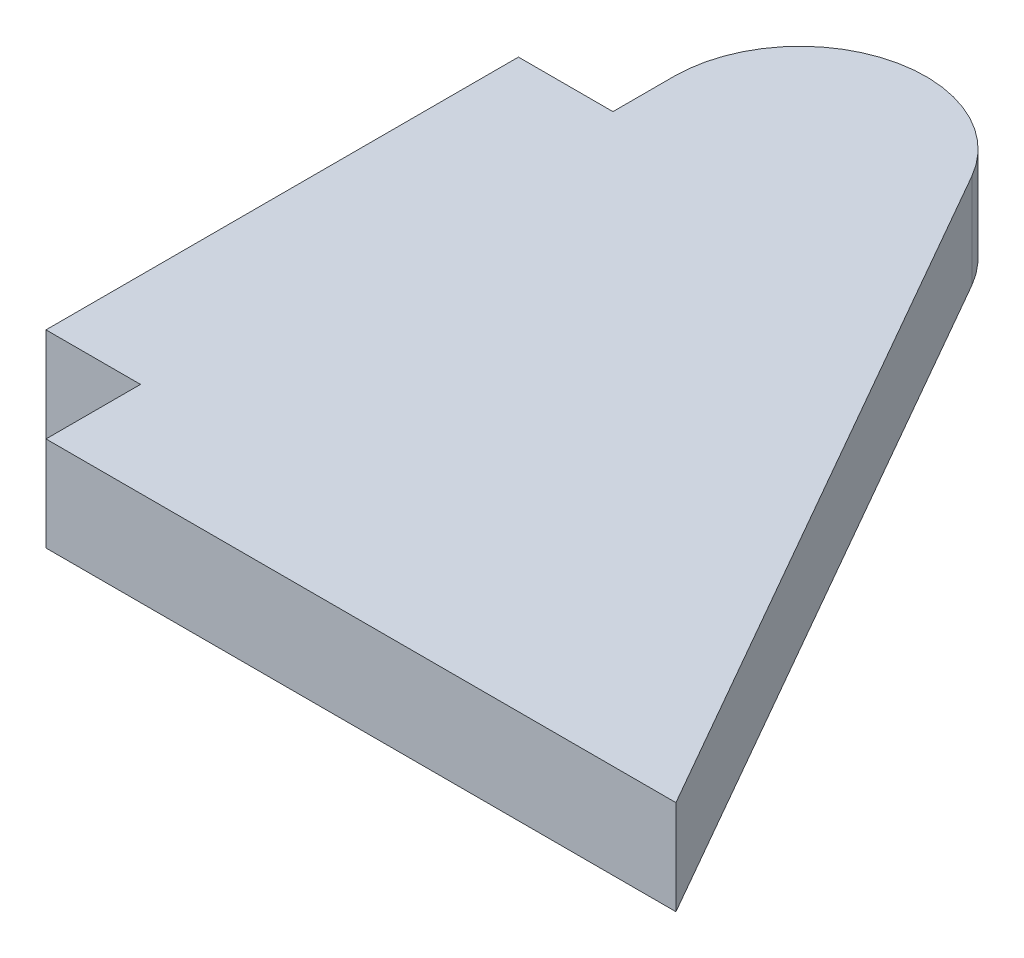
ISO-10303-21;
HEADER;
FILE_DESCRIPTION(('STEP AP214'),'2;1');
FILE_NAME('part.step','',(''),(''),'','','');
FILE_SCHEMA(('AUTOMOTIVE_DESIGN { 1 0 10303 214 1 1 1 1 }'));
ENDSEC;
DATA;
#1=APPLICATION_CONTEXT('core data for automotive mechanical design processes');
#2=APPLICATION_PROTOCOL_DEFINITION('international standard','automotive_design',2000,#1);
#3=PRODUCT_CONTEXT('',#1,'mechanical');
#4=PRODUCT('Part','Part','',(#3));
#5=PRODUCT_RELATED_PRODUCT_CATEGORY('part','',(#4));
#6=PRODUCT_DEFINITION_FORMATION('','',#4);
#7=PRODUCT_DEFINITION_CONTEXT('part definition',#1,'design');
#8=PRODUCT_DEFINITION('design','',#6,#7);
#9=PRODUCT_DEFINITION_SHAPE('','',#8);
#10=(LENGTH_UNIT() NAMED_UNIT(*) SI_UNIT(.MILLI.,.METRE.));
#11=(NAMED_UNIT(*) PLANE_ANGLE_UNIT() SI_UNIT($,.RADIAN.));
#12=(NAMED_UNIT(*) SI_UNIT($,.STERADIAN.) SOLID_ANGLE_UNIT());
#13=UNCERTAINTY_MEASURE_WITH_UNIT(LENGTH_MEASURE(1.E-05),#10,'distance_accuracy_value','');
#14=(GEOMETRIC_REPRESENTATION_CONTEXT(3) GLOBAL_UNCERTAINTY_ASSIGNED_CONTEXT((#13)) GLOBAL_UNIT_ASSIGNED_CONTEXT((#10,
#11,#12)) REPRESENTATION_CONTEXT('',''));
#15=CARTESIAN_POINT('',(0.,0.,0.));
#16=DIRECTION('',(0.,0.,1.));
#17=DIRECTION('',(1.,0.,0.));
#18=AXIS2_PLACEMENT_3D('',#15,#16,#17);
#19=CARTESIAN_POINT('',(-10.,1.5,-17.5));
#20=DIRECTION('',(1.,0.,0.));
#21=DIRECTION('',(0.,0.,-1.));
#22=AXIS2_PLACEMENT_3D('',#19,#20,#21);
#23=PLANE('',#22);
#24=DIRECTION('',(0.,0.,1.));
#25=VECTOR('',#24,1.);
#26=CARTESIAN_POINT('',(-10.,1.5,-17.5));
#27=LINE('',#26,#25);
#28=CARTESIAN_POINT('',(-10.,1.5,-2.43774225170145));
#29=VERTEX_POINT('',#28);
#30=CARTESIAN_POINT('',(-10.,1.5,-0.499999999999997));
#31=VERTEX_POINT('',#30);
#32=EDGE_CURVE('E99',#29,#31,#27,.T.);
#33=ORIENTED_EDGE('',*,*,#32,.F.);
#34=DIRECTION('',(0.,-1.,0.));
#35=VECTOR('',#34,1.);
#36=CARTESIAN_POINT('',(-10.,1.5,-2.43774225170145));
#37=LINE('',#36,#35);
#38=CARTESIAN_POINT('',(-10.,-1.5,-2.43774225170145));
#39=VERTEX_POINT('',#38);
#40=EDGE_CURVE('E144',#29,#39,#37,.T.);
#41=ORIENTED_EDGE('',*,*,#40,.T.);
#42=DIRECTION('',(0.,0.,1.));
#43=VECTOR('',#42,1.);
#44=CARTESIAN_POINT('',(-10.,-1.5,-17.5));
#45=LINE('',#44,#43);
#46=CARTESIAN_POINT('',(-10.,-1.5,-0.499999999999997));
#47=VERTEX_POINT('',#46);
#48=EDGE_CURVE('E122',#39,#47,#45,.T.);
#49=ORIENTED_EDGE('',*,*,#48,.T.);
#50=DIRECTION('',(0.,-1.,0.));
#51=VECTOR('',#50,1.);
#52=CARTESIAN_POINT('',(-10.,1.5,-0.499999999999997));
#53=LINE('',#52,#51);
#54=EDGE_CURVE('E115',#31,#47,#53,.T.);
#55=ORIENTED_EDGE('',*,*,#54,.F.);
#56=EDGE_LOOP('',(#33,#41,#49,#55));
#57=FACE_BOUND('',#56,.T.);
#58=ADVANCED_FACE('F35',(#57),#23,.F.);
#59=CARTESIAN_POINT('',(-10.,1.5,14.5));
#60=VERTEX_POINT('',#59);
#61=CARTESIAN_POINT('',(-10.,1.5,17.5));
#62=VERTEX_POINT('',#61);
#63=EDGE_CURVE('E110',#60,#62,#27,.T.);
#64=ORIENTED_EDGE('',*,*,#63,.F.);
#65=DIRECTION('',(0.,-1.,0.));
#66=VECTOR('',#65,1.);
#67=CARTESIAN_POINT('',(-10.,1.5,14.5));
#68=LINE('',#67,#66);
#69=CARTESIAN_POINT('',(-10.,-1.5,14.5));
#70=VERTEX_POINT('',#69);
#71=EDGE_CURVE('E159',#60,#70,#68,.T.);
#72=ORIENTED_EDGE('',*,*,#71,.T.);
#73=CARTESIAN_POINT('',(-10.,-1.5,17.5));
#74=VERTEX_POINT('',#73);
#75=EDGE_CURVE('E124',#70,#74,#45,.T.);
#76=ORIENTED_EDGE('',*,*,#75,.T.);
#77=DIRECTION('',(0.,-1.,0.));
#78=VECTOR('',#77,1.);
#79=CARTESIAN_POINT('',(-10.,1.5,17.5));
#80=LINE('',#79,#78);
#81=EDGE_CURVE('E141',#62,#74,#80,.T.);
#82=ORIENTED_EDGE('',*,*,#81,.F.);
#83=EDGE_LOOP('',(#64,#72,#76,#82));
#84=FACE_BOUND('',#83,.T.);
#85=ADVANCED_FACE('F173',(#84),#23,.F.);
#86=CARTESIAN_POINT('',(-10.,1.5,17.5));
#87=DIRECTION('',(0.,0.,-1.));
#88=DIRECTION('',(-1.,0.,0.));
#89=AXIS2_PLACEMENT_3D('',#86,#87,#88);
#90=PLANE('',#89);
#91=DIRECTION('',(1.,0.,0.));
#92=VECTOR('',#91,1.);
#93=CARTESIAN_POINT('',(-10.,-1.5,17.5));
#94=LINE('',#93,#92);
#95=CARTESIAN_POINT('',(10.,-1.5,17.5));
#96=VERTEX_POINT('',#95);
#97=EDGE_CURVE('E135',#74,#96,#94,.T.);
#98=ORIENTED_EDGE('',*,*,#97,.T.);
#99=DIRECTION('',(0.,-1.,0.));
#100=VECTOR('',#99,1.);
#101=CARTESIAN_POINT('',(10.,1.5,17.5));
#102=LINE('',#101,#100);
#103=CARTESIAN_POINT('',(10.,1.5,17.5));
#104=VERTEX_POINT('',#103);
#105=EDGE_CURVE('E133',#104,#96,#102,.T.);
#106=ORIENTED_EDGE('',*,*,#105,.F.);
#107=DIRECTION('',(1.,0.,0.));
#108=VECTOR('',#107,1.);
#109=CARTESIAN_POINT('',(-10.,1.5,17.5));
#110=LINE('',#109,#108);
#111=EDGE_CURVE('E109',#62,#104,#110,.T.);
#112=ORIENTED_EDGE('',*,*,#111,.F.);
#113=ORIENTED_EDGE('',*,*,#81,.T.);
#114=EDGE_LOOP('',(#98,#106,#112,#113));
#115=FACE_BOUND('',#114,.T.);
#116=ADVANCED_FACE('F177',(#115),#90,.F.);
#117=CARTESIAN_POINT('',(-10.,1.5,-17.5));
#118=DIRECTION('',(-0.868243142124459,0.,0.496138938356834));
#119=DIRECTION('',(0.496138938356834,0.,0.868243142124459));
#120=AXIS2_PLACEMENT_3D('',#117,#118,#119);
#121=PLANE('',#120);
#122=DIRECTION('',(-0.496138938356834,0.,-0.868243142124459));
#123=VECTOR('',#122,1.);
#124=CARTESIAN_POINT('',(-10.,-1.5,-17.5));
#125=LINE('',#124,#123);
#126=CARTESIAN_POINT('',(-2.52702743150216,-1.5,-4.42229800512879));
#127=VERTEX_POINT('',#126);
#128=EDGE_CURVE('E137',#96,#127,#125,.T.);
#129=ORIENTED_EDGE('',*,*,#128,.T.);
#130=DIRECTION('',(0.,-1.,0.));
#131=VECTOR('',#130,1.);
#132=CARTESIAN_POINT('',(-2.52702743150216,1.5,-4.42229800512879));
#133=LINE('',#132,#131);
#134=CARTESIAN_POINT('',(-2.52702743150216,1.5,-4.42229800512879));
#135=VERTEX_POINT('',#134);
#136=EDGE_CURVE('E43',#127,#135,#133,.F.);
#137=ORIENTED_EDGE('',*,*,#136,.T.);
#138=DIRECTION('',(-0.496138938356834,0.,-0.868243142124459));
#139=VECTOR('',#138,1.);
#140=CARTESIAN_POINT('',(-10.,1.5,-17.5));
#141=LINE('',#140,#139);
#142=EDGE_CURVE('E132',#104,#135,#141,.T.);
#143=ORIENTED_EDGE('',*,*,#142,.F.);
#144=ORIENTED_EDGE('',*,*,#105,.T.);
#145=EDGE_LOOP('',(#129,#137,#143,#144));
#146=FACE_BOUND('',#145,.T.);
#147=ADVANCED_FACE('F178',(#146),#121,.F.);
#148=CARTESIAN_POINT('',(0.,1.5,0.));
#149=DIRECTION('',(0.,1.,0.));
#150=DIRECTION('',(0.,0.,1.));
#151=AXIS2_PLACEMENT_3D('',#148,#149,#150);
#152=PLANE('',#151);
#153=ORIENTED_EDGE('',*,*,#142,.T.);
#154=CARTESIAN_POINT('',(-6.,1.5,-2.43774225170145));
#155=DIRECTION('',(0.,1.,0.));
#156=DIRECTION('',(0.,0.,1.));
#157=AXIS2_PLACEMENT_3D('',#154,#155,#156);
#158=CIRCLE('',#157,4.);
#159=EDGE_CURVE('E11',#135,#29,#158,.T.);
#160=ORIENTED_EDGE('',*,*,#159,.T.);
#161=ORIENTED_EDGE('',*,*,#32,.T.);
#162=DIRECTION('',(-1.,0.,0.));
#163=VECTOR('',#162,1.);
#164=CARTESIAN_POINT('',(-10.,1.5,-0.499999999999997));
#165=LINE('',#164,#163);
#166=CARTESIAN_POINT('',(-13.,1.5,-0.499999999999997));
#167=VERTEX_POINT('',#166);
#168=EDGE_CURVE('E102',#31,#167,#165,.T.);
#169=ORIENTED_EDGE('',*,*,#168,.T.);
#170=DIRECTION('',(0.,0.,1.));
#171=VECTOR('',#170,1.);
#172=CARTESIAN_POINT('',(-13.,1.5,-0.499999999999997));
#173=LINE('',#172,#171);
#174=CARTESIAN_POINT('',(-13.,1.5,14.5));
#175=VERTEX_POINT('',#174);
#176=EDGE_CURVE('E119',#167,#175,#173,.T.);
#177=ORIENTED_EDGE('',*,*,#176,.T.);
#178=DIRECTION('',(1.,0.,0.));
#179=VECTOR('',#178,1.);
#180=CARTESIAN_POINT('',(-10.,1.5,14.5));
#181=LINE('',#180,#179);
#182=EDGE_CURVE('E155',#175,#60,#181,.T.);
#183=ORIENTED_EDGE('',*,*,#182,.T.);
#184=ORIENTED_EDGE('',*,*,#63,.T.);
#185=ORIENTED_EDGE('',*,*,#111,.T.);
#186=EDGE_LOOP('',(#153,#160,#161,#169,#177,#183,#184,#185));
#187=FACE_BOUND('',#186,.T.);
#188=ADVANCED_FACE('F101',(#187),#152,.T.);
#189=CARTESIAN_POINT('',(0.,-1.5,0.));
#190=DIRECTION('',(0.,1.,0.));
#191=DIRECTION('',(0.,0.,1.));
#192=AXIS2_PLACEMENT_3D('',#189,#190,#191);
#193=PLANE('',#192);
#194=ORIENTED_EDGE('',*,*,#48,.F.);
#195=CARTESIAN_POINT('',(-6.,-1.5,-2.43774225170145));
#196=DIRECTION('',(0.,1.,0.));
#197=DIRECTION('',(0.,0.,1.));
#198=AXIS2_PLACEMENT_3D('',#195,#196,#197);
#199=CIRCLE('',#198,4.);
#200=EDGE_CURVE('E57',#39,#127,#199,.F.);
#201=ORIENTED_EDGE('',*,*,#200,.T.);
#202=ORIENTED_EDGE('',*,*,#128,.F.);
#203=ORIENTED_EDGE('',*,*,#97,.F.);
#204=ORIENTED_EDGE('',*,*,#75,.F.);
#205=DIRECTION('',(1.,0.,0.));
#206=VECTOR('',#205,1.);
#207=CARTESIAN_POINT('',(-10.,-1.5,14.5));
#208=LINE('',#207,#206);
#209=CARTESIAN_POINT('',(-13.,-1.5,14.5));
#210=VERTEX_POINT('',#209);
#211=EDGE_CURVE('E120',#210,#70,#208,.T.);
#212=ORIENTED_EDGE('',*,*,#211,.F.);
#213=DIRECTION('',(0.,0.,1.));
#214=VECTOR('',#213,1.);
#215=CARTESIAN_POINT('',(-13.,-1.5,-0.499999999999997));
#216=LINE('',#215,#214);
#217=CARTESIAN_POINT('',(-13.,-1.5,-0.499999999999997));
#218=VERTEX_POINT('',#217);
#219=EDGE_CURVE('E151',#218,#210,#216,.T.);
#220=ORIENTED_EDGE('',*,*,#219,.F.);
#221=DIRECTION('',(-1.,0.,0.));
#222=VECTOR('',#221,1.);
#223=CARTESIAN_POINT('',(-10.,-1.5,-0.499999999999997));
#224=LINE('',#223,#222);
#225=EDGE_CURVE('E149',#47,#218,#224,.T.);
#226=ORIENTED_EDGE('',*,*,#225,.F.);
#227=EDGE_LOOP('',(#194,#201,#202,#203,#204,#212,#220,#226));
#228=FACE_BOUND('',#227,.T.);
#229=ADVANCED_FACE('F147',(#228),#193,.F.);
#230=CARTESIAN_POINT('',(-10.,1.5,-0.499999999999997));
#231=DIRECTION('',(0.,0.,1.));
#232=DIRECTION('',(1.,0.,0.));
#233=AXIS2_PLACEMENT_3D('',#230,#231,#232);
#234=PLANE('',#233);
#235=ORIENTED_EDGE('',*,*,#225,.T.);
#236=DIRECTION('',(0.,-1.,0.));
#237=VECTOR('',#236,1.);
#238=CARTESIAN_POINT('',(-13.,1.5,-0.499999999999997));
#239=LINE('',#238,#237);
#240=EDGE_CURVE('E117',#167,#218,#239,.T.);
#241=ORIENTED_EDGE('',*,*,#240,.F.);
#242=ORIENTED_EDGE('',*,*,#168,.F.);
#243=ORIENTED_EDGE('',*,*,#54,.T.);
#244=EDGE_LOOP('',(#235,#241,#242,#243));
#245=FACE_BOUND('',#244,.T.);
#246=ADVANCED_FACE('F114',(#245),#234,.F.);
#247=CARTESIAN_POINT('',(-13.,1.5,-0.499999999999997));
#248=DIRECTION('',(1.,0.,0.));
#249=DIRECTION('',(0.,0.,-1.));
#250=AXIS2_PLACEMENT_3D('',#247,#248,#249);
#251=PLANE('',#250);
#252=ORIENTED_EDGE('',*,*,#219,.T.);
#253=DIRECTION('',(0.,-1.,0.));
#254=VECTOR('',#253,1.);
#255=CARTESIAN_POINT('',(-13.,1.5,14.5));
#256=LINE('',#255,#254);
#257=EDGE_CURVE('E127',#175,#210,#256,.T.);
#258=ORIENTED_EDGE('',*,*,#257,.F.);
#259=ORIENTED_EDGE('',*,*,#176,.F.);
#260=ORIENTED_EDGE('',*,*,#240,.T.);
#261=EDGE_LOOP('',(#252,#258,#259,#260));
#262=FACE_BOUND('',#261,.T.);
#263=ADVANCED_FACE('F183',(#262),#251,.F.);
#264=CARTESIAN_POINT('',(-10.,1.5,14.5));
#265=DIRECTION('',(0.,0.,-1.));
#266=DIRECTION('',(-1.,0.,0.));
#267=AXIS2_PLACEMENT_3D('',#264,#265,#266);
#268=PLANE('',#267);
#269=ORIENTED_EDGE('',*,*,#211,.T.);
#270=ORIENTED_EDGE('',*,*,#71,.F.);
#271=ORIENTED_EDGE('',*,*,#182,.F.);
#272=ORIENTED_EDGE('',*,*,#257,.T.);
#273=EDGE_LOOP('',(#269,#270,#271,#272));
#274=FACE_BOUND('',#273,.T.);
#275=ADVANCED_FACE('F165',(#274),#268,.F.);
#276=CARTESIAN_POINT('',(-6.,1.5,-2.43774225170145));
#277=DIRECTION('',(0.,-1.,0.));
#278=DIRECTION('',(0.,0.,-1.));
#279=AXIS2_PLACEMENT_3D('',#276,#277,#278);
#280=CYLINDRICAL_SURFACE('',#279,4.);
#281=ORIENTED_EDGE('',*,*,#159,.F.);
#282=ORIENTED_EDGE('',*,*,#136,.F.);
#283=ORIENTED_EDGE('',*,*,#200,.F.);
#284=ORIENTED_EDGE('',*,*,#40,.F.);
#285=EDGE_LOOP('',(#281,#282,#283,#284));
#286=FACE_BOUND('',#285,.T.);
#287=ADVANCED_FACE('F37',(#286),#280,.T.);
#288=CLOSED_SHELL('',(#58,#85,#116,#147,#188,#229,#246,#263,#275,#287));
#289=MANIFOLD_SOLID_BREP('B2',#288);
#290=ADVANCED_BREP_SHAPE_REPRESENTATION('',(#18,#289),#14);
#291=SHAPE_DEFINITION_REPRESENTATION(#9,#290);
ENDSEC;
END-ISO-10303-21;
